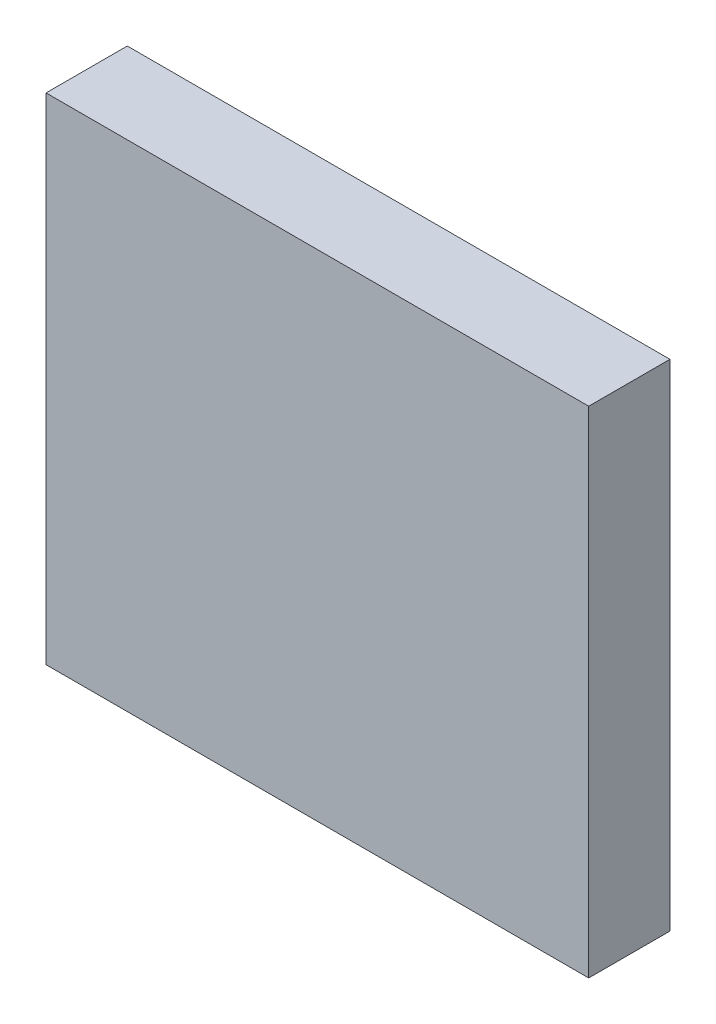
ISO-10303-21;
HEADER;
FILE_DESCRIPTION(('STEP AP214'),'2;1');
FILE_NAME('part.step','',(''),(''),'','','');
FILE_SCHEMA(('AUTOMOTIVE_DESIGN { 1 0 10303 214 1 1 1 1 }'));
ENDSEC;
DATA;
#1=APPLICATION_CONTEXT('core data for automotive mechanical design processes');
#2=APPLICATION_PROTOCOL_DEFINITION('international standard','automotive_design',2000,#1);
#3=PRODUCT_CONTEXT('',#1,'mechanical');
#4=PRODUCT('Part','Part','',(#3));
#5=PRODUCT_RELATED_PRODUCT_CATEGORY('part','',(#4));
#6=PRODUCT_DEFINITION_FORMATION('','',#4);
#7=PRODUCT_DEFINITION_CONTEXT('part definition',#1,'design');
#8=PRODUCT_DEFINITION('design','',#6,#7);
#9=PRODUCT_DEFINITION_SHAPE('','',#8);
#10=(LENGTH_UNIT() NAMED_UNIT(*) SI_UNIT(.MILLI.,.METRE.));
#11=(NAMED_UNIT(*) PLANE_ANGLE_UNIT() SI_UNIT($,.RADIAN.));
#12=(NAMED_UNIT(*) SI_UNIT($,.STERADIAN.) SOLID_ANGLE_UNIT());
#13=UNCERTAINTY_MEASURE_WITH_UNIT(LENGTH_MEASURE(1.E-05),#10,'distance_accuracy_value','');
#14=(GEOMETRIC_REPRESENTATION_CONTEXT(3) GLOBAL_UNCERTAINTY_ASSIGNED_CONTEXT((#13)) GLOBAL_UNIT_ASSIGNED_CONTEXT((#10,
#11,#12)) REPRESENTATION_CONTEXT('',''));
#15=CARTESIAN_POINT('',(0.,0.,0.));
#16=DIRECTION('',(0.,0.,1.));
#17=DIRECTION('',(1.,0.,0.));
#18=AXIS2_PLACEMENT_3D('',#15,#16,#17);
#19=CARTESIAN_POINT('',(-3.302,-3.048,1.));
#20=DIRECTION('',(1.,0.,0.));
#21=DIRECTION('',(0.,0.,-1.));
#22=AXIS2_PLACEMENT_3D('',#19,#20,#21);
#23=PLANE('',#22);
#24=DIRECTION('',(0.,-1.,0.));
#25=VECTOR('',#24,1.);
#26=CARTESIAN_POINT('',(-3.302,-3.048,0.));
#27=LINE('',#26,#25);
#28=CARTESIAN_POINT('',(-3.302,3.048,0.));
#29=VERTEX_POINT('',#28);
#30=CARTESIAN_POINT('',(-3.302,-3.048,0.));
#31=VERTEX_POINT('',#30);
#32=EDGE_CURVE('E95',#29,#31,#27,.T.);
#33=ORIENTED_EDGE('',*,*,#32,.T.);
#34=DIRECTION('',(0.,0.,-1.));
#35=VECTOR('',#34,1.);
#36=CARTESIAN_POINT('',(-3.302,-3.048,1.));
#37=LINE('',#36,#35);
#38=CARTESIAN_POINT('',(-3.302,-3.048,1.));
#39=VERTEX_POINT('',#38);
#40=EDGE_CURVE('E11',#39,#31,#37,.T.);
#41=ORIENTED_EDGE('',*,*,#40,.F.);
#42=DIRECTION('',(0.,-1.,0.));
#43=VECTOR('',#42,1.);
#44=CARTESIAN_POINT('',(-3.302,-3.048,1.));
#45=LINE('',#44,#43);
#46=CARTESIAN_POINT('',(-3.302,3.048,1.));
#47=VERTEX_POINT('',#46);
#48=EDGE_CURVE('E83',#47,#39,#45,.T.);
#49=ORIENTED_EDGE('',*,*,#48,.F.);
#50=DIRECTION('',(0.,0.,-1.));
#51=VECTOR('',#50,1.);
#52=CARTESIAN_POINT('',(-3.302,3.048,1.));
#53=LINE('',#52,#51);
#54=EDGE_CURVE('E91',#47,#29,#53,.T.);
#55=ORIENTED_EDGE('',*,*,#54,.T.);
#56=EDGE_LOOP('',(#33,#41,#49,#55));
#57=FACE_BOUND('',#56,.T.);
#58=ADVANCED_FACE('F32',(#57),#23,.F.);
#59=CARTESIAN_POINT('',(3.3782,-3.048,1.));
#60=DIRECTION('',(0.,1.,0.));
#61=DIRECTION('',(0.,0.,1.));
#62=AXIS2_PLACEMENT_3D('',#59,#60,#61);
#63=PLANE('',#62);
#64=DIRECTION('',(1.,0.,0.));
#65=VECTOR('',#64,1.);
#66=CARTESIAN_POINT('',(3.3782,-3.048,0.));
#67=LINE('',#66,#65);
#68=CARTESIAN_POINT('',(3.3782,-3.048,0.));
#69=VERTEX_POINT('',#68);
#70=EDGE_CURVE('E87',#31,#69,#67,.T.);
#71=ORIENTED_EDGE('',*,*,#70,.T.);
#72=DIRECTION('',(0.,0.,-1.));
#73=VECTOR('',#72,1.);
#74=CARTESIAN_POINT('',(3.3782,-3.048,1.));
#75=LINE('',#74,#73);
#76=CARTESIAN_POINT('',(3.3782,-3.048,1.));
#77=VERTEX_POINT('',#76);
#78=EDGE_CURVE('E40',#77,#69,#75,.T.);
#79=ORIENTED_EDGE('',*,*,#78,.F.);
#80=DIRECTION('',(1.,0.,0.));
#81=VECTOR('',#80,1.);
#82=CARTESIAN_POINT('',(3.3782,-3.048,1.));
#83=LINE('',#82,#81);
#84=EDGE_CURVE('E78',#39,#77,#83,.T.);
#85=ORIENTED_EDGE('',*,*,#84,.F.);
#86=ORIENTED_EDGE('',*,*,#40,.T.);
#87=EDGE_LOOP('',(#71,#79,#85,#86));
#88=FACE_BOUND('',#87,.T.);
#89=ADVANCED_FACE('F86',(#88),#63,.F.);
#90=CARTESIAN_POINT('',(3.3782,3.048,1.));
#91=DIRECTION('',(-1.,0.,0.));
#92=DIRECTION('',(0.,0.,1.));
#93=AXIS2_PLACEMENT_3D('',#90,#91,#92);
#94=PLANE('',#93);
#95=DIRECTION('',(0.,1.,0.));
#96=VECTOR('',#95,1.);
#97=CARTESIAN_POINT('',(3.3782,3.048,0.));
#98=LINE('',#97,#96);
#99=CARTESIAN_POINT('',(3.3782,3.048,0.));
#100=VERTEX_POINT('',#99);
#101=EDGE_CURVE('E65',#69,#100,#98,.T.);
#102=ORIENTED_EDGE('',*,*,#101,.T.);
#103=DIRECTION('',(0.,0.,-1.));
#104=VECTOR('',#103,1.);
#105=CARTESIAN_POINT('',(3.3782,3.048,1.));
#106=LINE('',#105,#104);
#107=CARTESIAN_POINT('',(3.3782,3.048,1.));
#108=VERTEX_POINT('',#107);
#109=EDGE_CURVE('E88',#108,#100,#106,.T.);
#110=ORIENTED_EDGE('',*,*,#109,.F.);
#111=DIRECTION('',(0.,1.,0.));
#112=VECTOR('',#111,1.);
#113=CARTESIAN_POINT('',(3.3782,3.048,1.));
#114=LINE('',#113,#112);
#115=EDGE_CURVE('E81',#77,#108,#114,.T.);
#116=ORIENTED_EDGE('',*,*,#115,.F.);
#117=ORIENTED_EDGE('',*,*,#78,.T.);
#118=EDGE_LOOP('',(#102,#110,#116,#117));
#119=FACE_BOUND('',#118,.T.);
#120=ADVANCED_FACE('F89',(#119),#94,.F.);
#121=CARTESIAN_POINT('',(-3.302,3.048,1.));
#122=DIRECTION('',(0.,-1.,0.));
#123=DIRECTION('',(0.,0.,-1.));
#124=AXIS2_PLACEMENT_3D('',#121,#122,#123);
#125=PLANE('',#124);
#126=DIRECTION('',(-1.,0.,0.));
#127=VECTOR('',#126,1.);
#128=CARTESIAN_POINT('',(-3.302,3.048,0.));
#129=LINE('',#128,#127);
#130=EDGE_CURVE('E71',#100,#29,#129,.T.);
#131=ORIENTED_EDGE('',*,*,#130,.T.);
#132=ORIENTED_EDGE('',*,*,#54,.F.);
#133=DIRECTION('',(-1.,0.,0.));
#134=VECTOR('',#133,1.);
#135=CARTESIAN_POINT('',(-3.302,3.048,1.));
#136=LINE('',#135,#134);
#137=EDGE_CURVE('E48',#108,#47,#136,.T.);
#138=ORIENTED_EDGE('',*,*,#137,.F.);
#139=ORIENTED_EDGE('',*,*,#109,.T.);
#140=EDGE_LOOP('',(#131,#132,#138,#139));
#141=FACE_BOUND('',#140,.T.);
#142=ADVANCED_FACE('F102',(#141),#125,.F.);
#143=CARTESIAN_POINT('',(0.,0.,1.));
#144=DIRECTION('',(0.,0.,-1.));
#145=DIRECTION('',(-1.,0.,0.));
#146=AXIS2_PLACEMENT_3D('',#143,#144,#145);
#147=PLANE('',#146);
#148=ORIENTED_EDGE('',*,*,#48,.T.);
#149=ORIENTED_EDGE('',*,*,#84,.T.);
#150=ORIENTED_EDGE('',*,*,#115,.T.);
#151=ORIENTED_EDGE('',*,*,#137,.T.);
#152=EDGE_LOOP('',(#148,#149,#150,#151));
#153=FACE_BOUND('',#152,.T.);
#154=ADVANCED_FACE('F79',(#153),#147,.F.);
#155=CARTESIAN_POINT('',(0.,0.,0.));
#156=DIRECTION('',(0.,0.,-1.));
#157=DIRECTION('',(-1.,0.,0.));
#158=AXIS2_PLACEMENT_3D('',#155,#156,#157);
#159=PLANE('',#158);
#160=ORIENTED_EDGE('',*,*,#32,.F.);
#161=ORIENTED_EDGE('',*,*,#130,.F.);
#162=ORIENTED_EDGE('',*,*,#101,.F.);
#163=ORIENTED_EDGE('',*,*,#70,.F.);
#164=EDGE_LOOP('',(#160,#161,#162,#163));
#165=FACE_BOUND('',#164,.T.);
#166=ADVANCED_FACE('F105',(#165),#159,.T.);
#167=CLOSED_SHELL('',(#58,#89,#120,#142,#154,#166));
#168=MANIFOLD_SOLID_BREP('B2',#167);
#169=ADVANCED_BREP_SHAPE_REPRESENTATION('',(#18,#168),#14);
#170=SHAPE_DEFINITION_REPRESENTATION(#9,#169);
ENDSEC;
END-ISO-10303-21;
